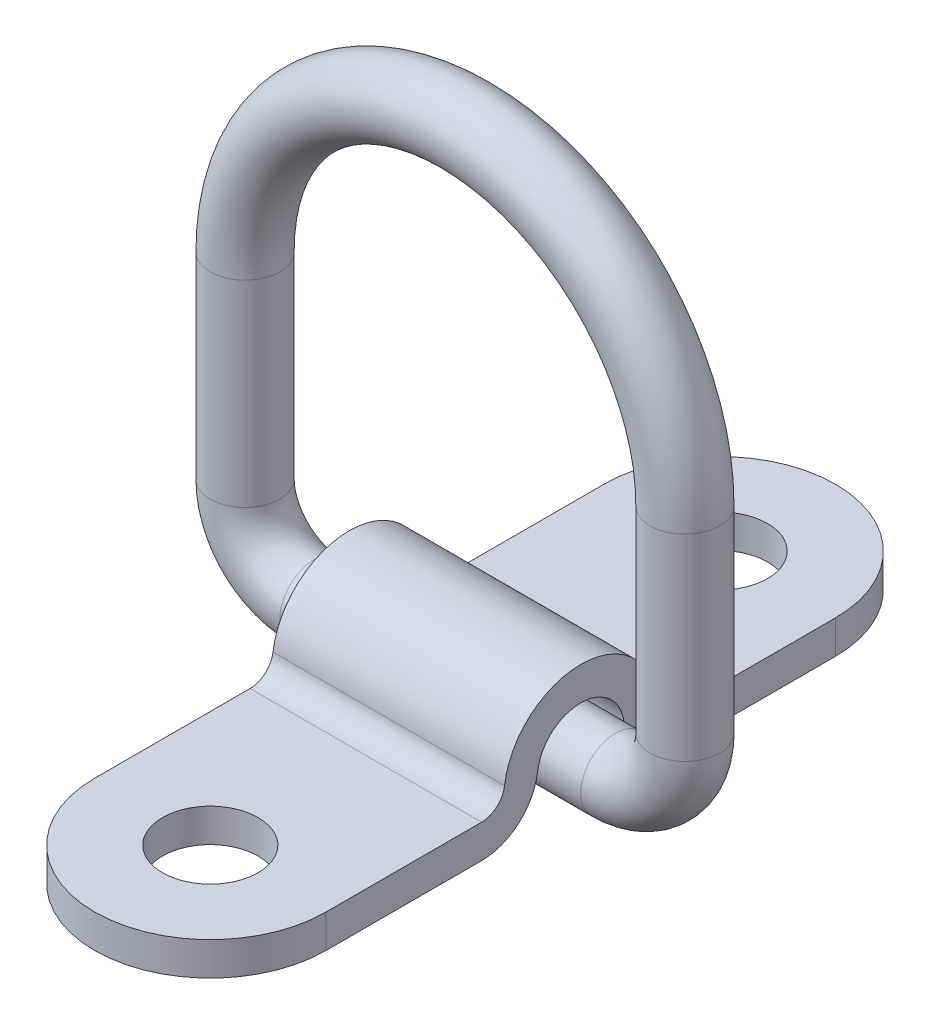
ISO-10303-21;
HEADER;
FILE_DESCRIPTION(('STEP AP214'),'2;1');
FILE_NAME('part.step','',(''),(''),'','','');
FILE_SCHEMA(('AUTOMOTIVE_DESIGN { 1 0 10303 214 1 1 1 1 }'));
ENDSEC;
DATA;
#1=APPLICATION_CONTEXT('core data for automotive mechanical design processes');
#2=APPLICATION_PROTOCOL_DEFINITION('international standard','automotive_design',2000,#1);
#3=PRODUCT_CONTEXT('',#1,'mechanical');
#4=PRODUCT('Part','Part','',(#3));
#5=PRODUCT_RELATED_PRODUCT_CATEGORY('part','',(#4));
#6=PRODUCT_DEFINITION_FORMATION('','',#4);
#7=PRODUCT_DEFINITION_CONTEXT('part definition',#1,'design');
#8=PRODUCT_DEFINITION('design','',#6,#7);
#9=PRODUCT_DEFINITION_SHAPE('','',#8);
#10=(LENGTH_UNIT() NAMED_UNIT(*) SI_UNIT(.MILLI.,.METRE.));
#11=(NAMED_UNIT(*) PLANE_ANGLE_UNIT() SI_UNIT($,.RADIAN.));
#12=(NAMED_UNIT(*) SI_UNIT($,.STERADIAN.) SOLID_ANGLE_UNIT());
#13=UNCERTAINTY_MEASURE_WITH_UNIT(LENGTH_MEASURE(1.E-05),#10,'distance_accuracy_value','');
#14=(GEOMETRIC_REPRESENTATION_CONTEXT(3) GLOBAL_UNCERTAINTY_ASSIGNED_CONTEXT((#13)) GLOBAL_UNIT_ASSIGNED_CONTEXT((#10,
#11,#12)) REPRESENTATION_CONTEXT('',''));
#15=CARTESIAN_POINT('',(0.,0.,0.));
#16=DIRECTION('',(0.,0.,1.));
#17=DIRECTION('',(1.,0.,0.));
#18=AXIS2_PLACEMENT_3D('',#15,#16,#17);
#19=CARTESIAN_POINT('',(7.9375,0.888999999999999,6.8001355133556));
#20=DIRECTION('',(-1.,0.,0.));
#21=DIRECTION('',(0.,0.,1.));
#22=AXIS2_PLACEMENT_3D('',#19,#20,#21);
#23=PLANE('',#22);
#24=DIRECTION('',(0.,0.,-1.));
#25=VECTOR('',#24,1.);
#26=CARTESIAN_POINT('',(7.9375,-2.9845,-25.4));
#27=LINE('',#26,#25);
#28=CARTESIAN_POINT('',(7.9375,-2.9845,-6.8001355133556));
#29=VERTEX_POINT('',#28);
#30=CARTESIAN_POINT('',(7.9375,-2.9845,-17.4625));
#31=VERTEX_POINT('',#30);
#32=EDGE_CURVE('E226',#29,#31,#27,.T.);
#33=ORIENTED_EDGE('',*,*,#32,.T.);
#34=DIRECTION('',(0.,-1.,0.));
#35=VECTOR('',#34,1.);
#36=CARTESIAN_POINT('',(7.9375,35.71875,-17.4625));
#37=LINE('',#36,#35);
#38=CARTESIAN_POINT('',(7.9375,-0.698499999999998,-17.4625));
#39=VERTEX_POINT('',#38);
#40=EDGE_CURVE('E205',#39,#31,#37,.T.);
#41=ORIENTED_EDGE('',*,*,#40,.F.);
#42=DIRECTION('',(0.,0.,1.));
#43=VECTOR('',#42,1.);
#44=CARTESIAN_POINT('',(7.9375,-0.698500000000001,-25.4));
#45=LINE('',#44,#43);
#46=CARTESIAN_POINT('',(7.9375,-0.698500000000001,-6.8001355133556));
#47=VERTEX_POINT('',#46);
#48=EDGE_CURVE('E134',#39,#47,#45,.T.);
#49=ORIENTED_EDGE('',*,*,#48,.T.);
#50=CARTESIAN_POINT('',(7.9375,0.888999999999999,-6.8001355133556));
#51=DIRECTION('',(-1.,0.,0.));
#52=DIRECTION('',(0.,0.,-1.));
#53=AXIS2_PLACEMENT_3D('',#50,#51,#52);
#54=CIRCLE('',#53,1.5875);
#55=CARTESIAN_POINT('',(7.9375,0.683212962962963,-5.22603007044921));
#56=VERTEX_POINT('',#55);
#57=EDGE_CURVE('E126',#47,#56,#54,.T.);
#58=ORIENTED_EDGE('',*,*,#57,.T.);
#59=CARTESIAN_POINT('',(7.9375,0.,0.));
#60=DIRECTION('',(1.,0.,0.));
#61=DIRECTION('',(0.,0.,1.));
#62=AXIS2_PLACEMENT_3D('',#59,#60,#61);
#63=CIRCLE('',#62,5.2705);
#64=CARTESIAN_POINT('',(7.9375,0.683212962962962,5.22603007044921));
#65=VERTEX_POINT('',#64);
#66=EDGE_CURVE('E130',#56,#65,#63,.T.);
#67=ORIENTED_EDGE('',*,*,#66,.T.);
#68=CARTESIAN_POINT('',(7.9375,0.888999999999999,6.8001355133556));
#69=DIRECTION('',(-1.,0.,0.));
#70=DIRECTION('',(0.,0.,1.));
#71=AXIS2_PLACEMENT_3D('',#68,#69,#70);
#72=CIRCLE('',#71,1.5875);
#73=CARTESIAN_POINT('',(7.9375,-0.698500000000001,6.8001355133556));
#74=VERTEX_POINT('',#73);
#75=EDGE_CURVE('E69',#65,#74,#72,.T.);
#76=ORIENTED_EDGE('',*,*,#75,.T.);
#77=DIRECTION('',(0.,0.,1.));
#78=VECTOR('',#77,1.);
#79=CARTESIAN_POINT('',(7.9375,-0.698500000000001,25.4));
#80=LINE('',#79,#78);
#81=CARTESIAN_POINT('',(7.9375,-0.698500000000005,17.4625));
#82=VERTEX_POINT('',#81);
#83=EDGE_CURVE('E151',#74,#82,#80,.T.);
#84=ORIENTED_EDGE('',*,*,#83,.T.);
#85=DIRECTION('',(0.,-1.,0.));
#86=VECTOR('',#85,1.);
#87=CARTESIAN_POINT('',(7.9375,35.71875,17.4625));
#88=LINE('',#87,#86);
#89=CARTESIAN_POINT('',(7.9375,-2.9845,17.4625));
#90=VERTEX_POINT('',#89);
#91=EDGE_CURVE('E216',#82,#90,#88,.T.);
#92=ORIENTED_EDGE('',*,*,#91,.T.);
#93=DIRECTION('',(0.,0.,-1.));
#94=VECTOR('',#93,1.);
#95=CARTESIAN_POINT('',(7.9375,-2.9845,25.4));
#96=LINE('',#95,#94);
#97=CARTESIAN_POINT('',(7.9375,-2.9845,6.8001355133556));
#98=VERTEX_POINT('',#97);
#99=EDGE_CURVE('E110',#90,#98,#96,.T.);
#100=ORIENTED_EDGE('',*,*,#99,.T.);
#101=CARTESIAN_POINT('',(7.9375,0.888999999999999,6.8001355133556));
#102=DIRECTION('',(1.,0.,0.));
#103=DIRECTION('',(0.,0.,-1.));
#104=AXIS2_PLACEMENT_3D('',#101,#102,#103);
#105=CIRCLE('',#104,3.8735);
#106=CARTESIAN_POINT('',(7.9375,0.386879629629629,2.95931823266401));
#107=VERTEX_POINT('',#106);
#108=EDGE_CURVE('E220',#98,#107,#105,.T.);
#109=ORIENTED_EDGE('',*,*,#108,.T.);
#110=CARTESIAN_POINT('',(7.9375,0.,0.));
#111=DIRECTION('',(-1.,0.,0.));
#112=DIRECTION('',(0.,0.,1.));
#113=AXIS2_PLACEMENT_3D('',#110,#111,#112);
#114=CIRCLE('',#113,2.9845);
#115=CARTESIAN_POINT('',(7.9375,0.386879629629629,-2.95931823266401));
#116=VERTEX_POINT('',#115);
#117=EDGE_CURVE('E222',#107,#116,#114,.T.);
#118=ORIENTED_EDGE('',*,*,#117,.T.);
#119=CARTESIAN_POINT('',(7.9375,0.888999999999999,-6.8001355133556));
#120=DIRECTION('',(1.,0.,0.));
#121=DIRECTION('',(0.,0.,1.));
#122=AXIS2_PLACEMENT_3D('',#119,#120,#121);
#123=CIRCLE('',#122,3.8735);
#124=EDGE_CURVE('E224',#116,#29,#123,.T.);
#125=ORIENTED_EDGE('',*,*,#124,.T.);
#126=EDGE_LOOP('',(#33,#41,#49,#58,#67,#76,#84,#92,#100,#109,#118,#125));
#127=FACE_BOUND('',#126,.T.);
#128=ADVANCED_FACE('F45',(#127),#23,.F.);
#129=CARTESIAN_POINT('',(-7.9375,0.888999999999999,6.8001355133556));
#130=DIRECTION('',(-1.,0.,0.));
#131=DIRECTION('',(0.,0.,1.));
#132=AXIS2_PLACEMENT_3D('',#129,#130,#131);
#133=PLANE('',#132);
#134=DIRECTION('',(0.,-1.,0.));
#135=VECTOR('',#134,1.);
#136=CARTESIAN_POINT('',(-7.9375,35.71875,-17.4625));
#137=LINE('',#136,#135);
#138=CARTESIAN_POINT('',(-7.9375,-0.698499999999998,-17.4625));
#139=VERTEX_POINT('',#138);
#140=CARTESIAN_POINT('',(-7.9375,-2.9845,-17.4625));
#141=VERTEX_POINT('',#140);
#142=EDGE_CURVE('E210',#139,#141,#137,.T.);
#143=ORIENTED_EDGE('',*,*,#142,.T.);
#144=DIRECTION('',(0.,0.,-1.));
#145=VECTOR('',#144,1.);
#146=CARTESIAN_POINT('',(-7.9375,-2.9845,-25.4));
#147=LINE('',#146,#145);
#148=CARTESIAN_POINT('',(-7.9375,-2.9845,-6.8001355133556));
#149=VERTEX_POINT('',#148);
#150=EDGE_CURVE('E165',#149,#141,#147,.T.);
#151=ORIENTED_EDGE('',*,*,#150,.F.);
#152=CARTESIAN_POINT('',(-7.9375,0.888999999999999,-6.8001355133556));
#153=DIRECTION('',(1.,0.,0.));
#154=DIRECTION('',(0.,0.,1.));
#155=AXIS2_PLACEMENT_3D('',#152,#153,#154);
#156=CIRCLE('',#155,3.8735);
#157=CARTESIAN_POINT('',(-7.9375,0.386879629629629,-2.95931823266401));
#158=VERTEX_POINT('',#157);
#159=EDGE_CURVE('E163',#158,#149,#156,.T.);
#160=ORIENTED_EDGE('',*,*,#159,.F.);
#161=CARTESIAN_POINT('',(-7.9375,0.,0.));
#162=DIRECTION('',(-1.,0.,0.));
#163=DIRECTION('',(0.,0.,1.));
#164=AXIS2_PLACEMENT_3D('',#161,#162,#163);
#165=CIRCLE('',#164,2.9845);
#166=CARTESIAN_POINT('',(-7.9375,0.386879629629629,2.95931823266401));
#167=VERTEX_POINT('',#166);
#168=EDGE_CURVE('E161',#167,#158,#165,.T.);
#169=ORIENTED_EDGE('',*,*,#168,.F.);
#170=CARTESIAN_POINT('',(-7.9375,0.888999999999999,6.8001355133556));
#171=DIRECTION('',(1.,0.,0.));
#172=DIRECTION('',(0.,0.,-1.));
#173=AXIS2_PLACEMENT_3D('',#170,#171,#172);
#174=CIRCLE('',#173,3.8735);
#175=CARTESIAN_POINT('',(-7.9375,-2.9845,6.8001355133556));
#176=VERTEX_POINT('',#175);
#177=EDGE_CURVE('E159',#176,#167,#174,.T.);
#178=ORIENTED_EDGE('',*,*,#177,.F.);
#179=DIRECTION('',(0.,0.,-1.));
#180=VECTOR('',#179,1.);
#181=CARTESIAN_POINT('',(-7.9375,-2.9845,25.4));
#182=LINE('',#181,#180);
#183=CARTESIAN_POINT('',(-7.9375,-2.9845,17.4625));
#184=VERTEX_POINT('',#183);
#185=EDGE_CURVE('E157',#184,#176,#182,.T.);
#186=ORIENTED_EDGE('',*,*,#185,.F.);
#187=DIRECTION('',(0.,-1.,0.));
#188=VECTOR('',#187,1.);
#189=CARTESIAN_POINT('',(-7.9375,35.71875,17.4625));
#190=LINE('',#189,#188);
#191=CARTESIAN_POINT('',(-7.9375,-0.698500000000001,17.4625));
#192=VERTEX_POINT('',#191);
#193=EDGE_CURVE('E53',#184,#192,#190,.F.);
#194=ORIENTED_EDGE('',*,*,#193,.T.);
#195=DIRECTION('',(0.,0.,1.));
#196=VECTOR('',#195,1.);
#197=CARTESIAN_POINT('',(-7.9375,-0.698500000000001,25.4));
#198=LINE('',#197,#196);
#199=CARTESIAN_POINT('',(-7.9375,-0.698500000000001,6.8001355133556));
#200=VERTEX_POINT('',#199);
#201=EDGE_CURVE('E174',#200,#192,#198,.T.);
#202=ORIENTED_EDGE('',*,*,#201,.F.);
#203=CARTESIAN_POINT('',(-7.9375,0.888999999999999,6.8001355133556));
#204=DIRECTION('',(-1.,0.,0.));
#205=DIRECTION('',(0.,0.,1.));
#206=AXIS2_PLACEMENT_3D('',#203,#204,#205);
#207=CIRCLE('',#206,1.5875);
#208=CARTESIAN_POINT('',(-7.9375,0.683212962962962,5.22603007044921));
#209=VERTEX_POINT('',#208);
#210=EDGE_CURVE('E102',#209,#200,#207,.T.);
#211=ORIENTED_EDGE('',*,*,#210,.F.);
#212=CARTESIAN_POINT('',(-7.9375,0.,0.));
#213=DIRECTION('',(1.,0.,0.));
#214=DIRECTION('',(0.,0.,1.));
#215=AXIS2_PLACEMENT_3D('',#212,#213,#214);
#216=CIRCLE('',#215,5.2705);
#217=CARTESIAN_POINT('',(-7.9375,0.683212962962963,-5.22603007044921));
#218=VERTEX_POINT('',#217);
#219=EDGE_CURVE('E171',#218,#209,#216,.T.);
#220=ORIENTED_EDGE('',*,*,#219,.F.);
#221=CARTESIAN_POINT('',(-7.9375,0.888999999999999,-6.8001355133556));
#222=DIRECTION('',(-1.,0.,0.));
#223=DIRECTION('',(0.,0.,-1.));
#224=AXIS2_PLACEMENT_3D('',#221,#222,#223);
#225=CIRCLE('',#224,1.5875);
#226=CARTESIAN_POINT('',(-7.9375,-0.698500000000001,-6.8001355133556));
#227=VERTEX_POINT('',#226);
#228=EDGE_CURVE('E143',#227,#218,#225,.T.);
#229=ORIENTED_EDGE('',*,*,#228,.F.);
#230=DIRECTION('',(0.,0.,1.));
#231=VECTOR('',#230,1.);
#232=CARTESIAN_POINT('',(-7.9375,-0.698500000000001,-25.4));
#233=LINE('',#232,#231);
#234=EDGE_CURVE('E168',#139,#227,#233,.T.);
#235=ORIENTED_EDGE('',*,*,#234,.F.);
#236=EDGE_LOOP('',(#143,#151,#160,#169,#178,#186,#194,#202,#211,#220,#229,#235));
#237=FACE_BOUND('',#236,.T.);
#238=ADVANCED_FACE('F247',(#237),#133,.T.);
#239=CARTESIAN_POINT('',(7.9375,-2.9845,25.4));
#240=DIRECTION('',(0.,1.,0.));
#241=DIRECTION('',(0.,0.,1.));
#242=AXIS2_PLACEMENT_3D('',#239,#240,#241);
#243=PLANE('',#242);
#244=CARTESIAN_POINT('',(0.,-2.9845,17.4625));
#245=DIRECTION('',(0.,-1.,0.));
#246=DIRECTION('',(0.,0.,-1.));
#247=AXIS2_PLACEMENT_3D('',#244,#245,#246);
#248=CIRCLE('',#247,3.2766);
#249=CARTESIAN_POINT('',(0.,-2.9845,14.1859));
#250=VERTEX_POINT('',#249);
#251=EDGE_CURVE('E196',#250,#250,#248,.T.);
#252=ORIENTED_EDGE('',*,*,#251,.F.);
#253=EDGE_LOOP('',(#252));
#254=FACE_BOUND('',#253,.T.);
#255=CARTESIAN_POINT('',(0.,-2.9845,17.4625));
#256=DIRECTION('',(0.,1.,0.));
#257=DIRECTION('',(0.,0.,-1.));
#258=AXIS2_PLACEMENT_3D('',#255,#256,#257);
#259=CIRCLE('',#258,7.9375);
#260=EDGE_CURVE('E195',#184,#90,#259,.T.);
#261=ORIENTED_EDGE('',*,*,#260,.F.);
#262=ORIENTED_EDGE('',*,*,#185,.T.);
#263=DIRECTION('',(-1.,0.,0.));
#264=VECTOR('',#263,1.);
#265=CARTESIAN_POINT('',(7.9375,-2.9845,6.8001355133556));
#266=LINE('',#265,#264);
#267=EDGE_CURVE('E189',#98,#176,#266,.T.);
#268=ORIENTED_EDGE('',*,*,#267,.F.);
#269=ORIENTED_EDGE('',*,*,#99,.F.);
#270=EDGE_LOOP('',(#261,#262,#268,#269));
#271=FACE_BOUND('',#270,.T.);
#272=ADVANCED_FACE('F47',(#254,#271),#243,.F.);
#273=CARTESIAN_POINT('',(7.9375,0.888999999999999,6.8001355133556));
#274=DIRECTION('',(-1.,0.,0.));
#275=DIRECTION('',(0.,0.,1.));
#276=AXIS2_PLACEMENT_3D('',#273,#274,#275);
#277=CYLINDRICAL_SURFACE('',#276,3.8735);
#278=ORIENTED_EDGE('',*,*,#177,.T.);
#279=DIRECTION('',(-1.,0.,0.));
#280=VECTOR('',#279,1.);
#281=CARTESIAN_POINT('',(7.9375,0.386879629629629,2.95931823266401));
#282=LINE('',#281,#280);
#283=EDGE_CURVE('E186',#107,#167,#282,.T.);
#284=ORIENTED_EDGE('',*,*,#283,.F.);
#285=ORIENTED_EDGE('',*,*,#108,.F.);
#286=ORIENTED_EDGE('',*,*,#267,.T.);
#287=EDGE_LOOP('',(#278,#284,#285,#286));
#288=FACE_BOUND('',#287,.T.);
#289=ADVANCED_FACE('F270',(#288),#277,.T.);
#290=CARTESIAN_POINT('',(7.9375,0.,0.));
#291=DIRECTION('',(-1.,0.,0.));
#292=DIRECTION('',(0.,0.,1.));
#293=AXIS2_PLACEMENT_3D('',#290,#291,#292);
#294=CYLINDRICAL_SURFACE('',#293,2.9845);
#295=ORIENTED_EDGE('',*,*,#168,.T.);
#296=DIRECTION('',(-1.,0.,0.));
#297=VECTOR('',#296,1.);
#298=CARTESIAN_POINT('',(7.9375,0.386879629629629,-2.95931823266401));
#299=LINE('',#298,#297);
#300=EDGE_CURVE('E183',#116,#158,#299,.T.);
#301=ORIENTED_EDGE('',*,*,#300,.F.);
#302=ORIENTED_EDGE('',*,*,#117,.F.);
#303=ORIENTED_EDGE('',*,*,#283,.T.);
#304=EDGE_LOOP('',(#295,#301,#302,#303));
#305=FACE_BOUND('',#304,.T.);
#306=ADVANCED_FACE('F275',(#305),#294,.F.);
#307=CARTESIAN_POINT('',(7.9375,0.888999999999999,-6.8001355133556));
#308=DIRECTION('',(-1.,0.,0.));
#309=DIRECTION('',(0.,0.,1.));
#310=AXIS2_PLACEMENT_3D('',#307,#308,#309);
#311=CYLINDRICAL_SURFACE('',#310,3.8735);
#312=ORIENTED_EDGE('',*,*,#159,.T.);
#313=DIRECTION('',(-1.,0.,0.));
#314=VECTOR('',#313,1.);
#315=CARTESIAN_POINT('',(7.9375,-2.9845,-6.8001355133556));
#316=LINE('',#315,#314);
#317=EDGE_CURVE('E180',#29,#149,#316,.T.);
#318=ORIENTED_EDGE('',*,*,#317,.F.);
#319=ORIENTED_EDGE('',*,*,#124,.F.);
#320=ORIENTED_EDGE('',*,*,#300,.T.);
#321=EDGE_LOOP('',(#312,#318,#319,#320));
#322=FACE_BOUND('',#321,.T.);
#323=ADVANCED_FACE('F277',(#322),#311,.T.);
#324=CARTESIAN_POINT('',(7.9375,-2.9845,-25.4));
#325=DIRECTION('',(0.,1.,0.));
#326=DIRECTION('',(0.,0.,1.));
#327=AXIS2_PLACEMENT_3D('',#324,#325,#326);
#328=PLANE('',#327);
#329=CARTESIAN_POINT('',(0.,-2.9845,-17.4625));
#330=DIRECTION('',(0.,-1.,0.));
#331=DIRECTION('',(0.,0.,1.));
#332=AXIS2_PLACEMENT_3D('',#329,#330,#331);
#333=CIRCLE('',#332,3.2766);
#334=CARTESIAN_POINT('',(0.,-2.9845,-14.1859));
#335=VERTEX_POINT('',#334);
#336=EDGE_CURVE('E199',#335,#335,#333,.T.);
#337=ORIENTED_EDGE('',*,*,#336,.F.);
#338=EDGE_LOOP('',(#337));
#339=FACE_BOUND('',#338,.T.);
#340=ORIENTED_EDGE('',*,*,#150,.T.);
#341=CARTESIAN_POINT('',(0.,-2.9845,-17.4625));
#342=DIRECTION('',(0.,1.,0.));
#343=DIRECTION('',(0.,0.,1.));
#344=AXIS2_PLACEMENT_3D('',#341,#342,#343);
#345=CIRCLE('',#344,7.9375);
#346=EDGE_CURVE('E240',#31,#141,#345,.T.);
#347=ORIENTED_EDGE('',*,*,#346,.F.);
#348=ORIENTED_EDGE('',*,*,#32,.F.);
#349=ORIENTED_EDGE('',*,*,#317,.T.);
#350=EDGE_LOOP('',(#340,#347,#348,#349));
#351=FACE_BOUND('',#350,.T.);
#352=ADVANCED_FACE('F237',(#339,#351),#328,.F.);
#353=CARTESIAN_POINT('',(7.9375,-0.698500000000001,-25.4));
#354=DIRECTION('',(0.,-1.,0.));
#355=DIRECTION('',(0.,0.,-1.));
#356=AXIS2_PLACEMENT_3D('',#353,#354,#355);
#357=PLANE('',#356);
#358=CARTESIAN_POINT('',(0.,-0.698499999999998,-17.4625));
#359=DIRECTION('',(0.,-1.,0.));
#360=DIRECTION('',(0.,0.,-1.));
#361=AXIS2_PLACEMENT_3D('',#358,#359,#360);
#362=CIRCLE('',#361,3.2766);
#363=CARTESIAN_POINT('',(0.,-0.698499999999998,-20.7391));
#364=VERTEX_POINT('',#363);
#365=EDGE_CURVE('E197',#364,#364,#362,.T.);
#366=ORIENTED_EDGE('',*,*,#365,.T.);
#367=EDGE_LOOP('',(#366));
#368=FACE_BOUND('',#367,.T.);
#369=CARTESIAN_POINT('',(0.,-0.698499999999998,-17.4625));
#370=DIRECTION('',(0.,-1.,0.));
#371=DIRECTION('',(0.,0.,-1.));
#372=AXIS2_PLACEMENT_3D('',#369,#370,#371);
#373=CIRCLE('',#372,7.9375);
#374=EDGE_CURVE('E12',#39,#139,#373,.F.);
#375=ORIENTED_EDGE('',*,*,#374,.T.);
#376=ORIENTED_EDGE('',*,*,#234,.T.);
#377=DIRECTION('',(-1.,0.,0.));
#378=VECTOR('',#377,1.);
#379=CARTESIAN_POINT('',(7.9375,-0.698500000000001,-6.8001355133556));
#380=LINE('',#379,#378);
#381=EDGE_CURVE('E146',#47,#227,#380,.T.);
#382=ORIENTED_EDGE('',*,*,#381,.F.);
#383=ORIENTED_EDGE('',*,*,#48,.F.);
#384=EDGE_LOOP('',(#375,#376,#382,#383));
#385=FACE_BOUND('',#384,.T.);
#386=ADVANCED_FACE('F285',(#368,#385),#357,.F.);
#387=CARTESIAN_POINT('',(7.9375,0.888999999999999,-6.8001355133556));
#388=DIRECTION('',(-1.,0.,0.));
#389=DIRECTION('',(0.,0.,1.));
#390=AXIS2_PLACEMENT_3D('',#387,#388,#389);
#391=CYLINDRICAL_SURFACE('',#390,1.5875);
#392=ORIENTED_EDGE('',*,*,#228,.T.);
#393=DIRECTION('',(-1.,0.,0.));
#394=VECTOR('',#393,1.);
#395=CARTESIAN_POINT('',(7.9375,0.683212962962963,-5.22603007044921));
#396=LINE('',#395,#394);
#397=EDGE_CURVE('E140',#56,#218,#396,.T.);
#398=ORIENTED_EDGE('',*,*,#397,.F.);
#399=ORIENTED_EDGE('',*,*,#57,.F.);
#400=ORIENTED_EDGE('',*,*,#381,.T.);
#401=EDGE_LOOP('',(#392,#398,#399,#400));
#402=FACE_BOUND('',#401,.T.);
#403=ADVANCED_FACE('F141',(#402),#391,.F.);
#404=CARTESIAN_POINT('',(7.9375,0.,0.));
#405=DIRECTION('',(-1.,0.,0.));
#406=DIRECTION('',(0.,0.,1.));
#407=AXIS2_PLACEMENT_3D('',#404,#405,#406);
#408=CYLINDRICAL_SURFACE('',#407,5.2705);
#409=ORIENTED_EDGE('',*,*,#219,.T.);
#410=DIRECTION('',(-1.,0.,0.));
#411=VECTOR('',#410,1.);
#412=CARTESIAN_POINT('',(7.9375,0.683212962962962,5.22603007044921));
#413=LINE('',#412,#411);
#414=EDGE_CURVE('E147',#65,#209,#413,.T.);
#415=ORIENTED_EDGE('',*,*,#414,.F.);
#416=ORIENTED_EDGE('',*,*,#66,.F.);
#417=ORIENTED_EDGE('',*,*,#397,.T.);
#418=EDGE_LOOP('',(#409,#415,#416,#417));
#419=FACE_BOUND('',#418,.T.);
#420=ADVANCED_FACE('F149',(#419),#408,.T.);
#421=CARTESIAN_POINT('',(7.9375,0.888999999999999,6.8001355133556));
#422=DIRECTION('',(-1.,0.,0.));
#423=DIRECTION('',(0.,0.,1.));
#424=AXIS2_PLACEMENT_3D('',#421,#422,#423);
#425=CYLINDRICAL_SURFACE('',#424,1.5875);
#426=ORIENTED_EDGE('',*,*,#210,.T.);
#427=DIRECTION('',(-1.,0.,0.));
#428=VECTOR('',#427,1.);
#429=CARTESIAN_POINT('',(7.9375,-0.698500000000001,6.8001355133556));
#430=LINE('',#429,#428);
#431=EDGE_CURVE('E156',#74,#200,#430,.T.);
#432=ORIENTED_EDGE('',*,*,#431,.F.);
#433=ORIENTED_EDGE('',*,*,#75,.F.);
#434=ORIENTED_EDGE('',*,*,#414,.T.);
#435=EDGE_LOOP('',(#426,#432,#433,#434));
#436=FACE_BOUND('',#435,.T.);
#437=ADVANCED_FACE('F301',(#436),#425,.F.);
#438=CARTESIAN_POINT('',(7.9375,-0.698500000000001,25.4));
#439=DIRECTION('',(0.,-1.,0.));
#440=DIRECTION('',(0.,0.,-1.));
#441=AXIS2_PLACEMENT_3D('',#438,#439,#440);
#442=PLANE('',#441);
#443=CARTESIAN_POINT('',(0.,-0.698499999999998,17.4625));
#444=DIRECTION('',(0.,-1.,0.));
#445=DIRECTION('',(0.,0.,-1.));
#446=AXIS2_PLACEMENT_3D('',#443,#444,#445);
#447=CIRCLE('',#446,3.2766);
#448=CARTESIAN_POINT('',(0.,-0.698499999999998,14.1859));
#449=VERTEX_POINT('',#448);
#450=EDGE_CURVE('E193',#449,#449,#447,.T.);
#451=ORIENTED_EDGE('',*,*,#450,.T.);
#452=EDGE_LOOP('',(#451));
#453=FACE_BOUND('',#452,.T.);
#454=ORIENTED_EDGE('',*,*,#201,.T.);
#455=CARTESIAN_POINT('',(0.,-0.698499999999998,17.4625));
#456=DIRECTION('',(0.,-1.,0.));
#457=DIRECTION('',(0.,0.,-1.));
#458=AXIS2_PLACEMENT_3D('',#455,#456,#457);
#459=CIRCLE('',#458,7.9375);
#460=EDGE_CURVE('E60',#192,#82,#459,.F.);
#461=ORIENTED_EDGE('',*,*,#460,.T.);
#462=ORIENTED_EDGE('',*,*,#83,.F.);
#463=ORIENTED_EDGE('',*,*,#431,.T.);
#464=EDGE_LOOP('',(#454,#461,#462,#463));
#465=FACE_BOUND('',#464,.T.);
#466=ADVANCED_FACE('F263',(#453,#465),#442,.F.);
#467=CARTESIAN_POINT('',(0.,35.71875,17.4625));
#468=DIRECTION('',(0.,-1.,0.));
#469=DIRECTION('',(0.,0.,-1.));
#470=AXIS2_PLACEMENT_3D('',#467,#468,#469);
#471=CYLINDRICAL_SURFACE('',#470,7.9375);
#472=ORIENTED_EDGE('',*,*,#260,.T.);
#473=ORIENTED_EDGE('',*,*,#91,.F.);
#474=ORIENTED_EDGE('',*,*,#460,.F.);
#475=ORIENTED_EDGE('',*,*,#193,.F.);
#476=EDGE_LOOP('',(#472,#473,#474,#475));
#477=FACE_BOUND('',#476,.T.);
#478=ADVANCED_FACE('F260',(#477),#471,.T.);
#479=CARTESIAN_POINT('',(0.,35.71875,17.4625));
#480=DIRECTION('',(0.,-1.,0.));
#481=DIRECTION('',(0.,0.,-1.));
#482=AXIS2_PLACEMENT_3D('',#479,#480,#481);
#483=CYLINDRICAL_SURFACE('',#482,3.2766);
#484=ORIENTED_EDGE('',*,*,#251,.T.);
#485=EDGE_LOOP('',(#484));
#486=FACE_BOUND('',#485,.T.);
#487=ORIENTED_EDGE('',*,*,#450,.F.);
#488=EDGE_LOOP('',(#487));
#489=FACE_BOUND('',#488,.T.);
#490=ADVANCED_FACE('F326',(#486,#489),#483,.F.);
#491=CARTESIAN_POINT('',(0.,35.71875,-17.4625));
#492=DIRECTION('',(0.,-1.,0.));
#493=DIRECTION('',(0.,0.,-1.));
#494=AXIS2_PLACEMENT_3D('',#491,#492,#493);
#495=CYLINDRICAL_SURFACE('',#494,3.2766);
#496=ORIENTED_EDGE('',*,*,#336,.T.);
#497=EDGE_LOOP('',(#496));
#498=FACE_BOUND('',#497,.T.);
#499=ORIENTED_EDGE('',*,*,#365,.F.);
#500=EDGE_LOOP('',(#499));
#501=FACE_BOUND('',#500,.T.);
#502=ADVANCED_FACE('F332',(#498,#501),#495,.F.);
#503=CARTESIAN_POINT('',(0.,35.71875,-17.4625));
#504=DIRECTION('',(0.,-1.,0.));
#505=DIRECTION('',(0.,0.,-1.));
#506=AXIS2_PLACEMENT_3D('',#503,#504,#505);
#507=CYLINDRICAL_SURFACE('',#506,7.9375);
#508=ORIENTED_EDGE('',*,*,#346,.T.);
#509=ORIENTED_EDGE('',*,*,#142,.F.);
#510=ORIENTED_EDGE('',*,*,#374,.F.);
#511=ORIENTED_EDGE('',*,*,#40,.T.);
#512=EDGE_LOOP('',(#508,#509,#510,#511));
#513=FACE_BOUND('',#512,.T.);
#514=ADVANCED_FACE('F251',(#513),#507,.T.);
#515=CLOSED_SHELL('',(#128,#238,#272,#289,#306,#323,#352,#386,#403,#420,#437,#466,#478,#490,
#502,#514));
#516=MANIFOLD_SOLID_BREP('B2',#515);
#517=CARTESIAN_POINT('',(10.31875,4.7625,0.));
#518=DIRECTION('',(0.,0.,-1.));
#519=DIRECTION('',(-1.,0.,0.));
#520=AXIS2_PLACEMENT_3D('',#517,#518,#519);
#521=TOROIDAL_SURFACE('',#520,4.7625,2.38125000000001);
#522=CARTESIAN_POINT('',(15.08125,4.7625,0.));
#523=DIRECTION('',(0.,1.,0.));
#524=DIRECTION('',(0.,0.,-1.));
#525=AXIS2_PLACEMENT_3D('',#522,#523,#524);
#526=CIRCLE('',#525,2.38125000000001);
#527=CARTESIAN_POINT('',(17.4625,4.7625,0.));
#528=VERTEX_POINT('',#527);
#529=EDGE_CURVE('E393',#528,#528,#526,.T.);
#530=CARTESIAN_POINT('',(10.31875,0.,0.));
#531=DIRECTION('',(1.,0.,0.));
#532=DIRECTION('',(0.,0.,-1.));
#533=AXIS2_PLACEMENT_3D('',#530,#531,#532);
#534=CIRCLE('',#533,2.38125000000001);
#535=CARTESIAN_POINT('',(10.31875,-2.38125,0.));
#536=VERTEX_POINT('',#535);
#537=EDGE_CURVE('E44',#536,#536,#534,.T.);
#538=CARTESIAN_POINT('',(10.31875,4.7625,0.));
#539=DIRECTION('',(0.,0.,-1.));
#540=DIRECTION('',(-1.,0.,0.));
#541=AXIS2_PLACEMENT_3D('',#538,#539,#540);
#542=CIRCLE('',#541,7.14375);
#543=EDGE_CURVE('',#528,#536,#542,.T.);
#544=ORIENTED_EDGE('',*,*,#529,.F.);
#545=ORIENTED_EDGE('',*,*,#537,.T.);
#546=ORIENTED_EDGE('',*,*,#543,.T.);
#547=ORIENTED_EDGE('',*,*,#543,.F.);
#548=EDGE_LOOP('',(#544,#546,#545,#547));
#549=FACE_BOUND('',#548,.T.);
#550=ADVANCED_FACE('F387',(#549),#521,.T.);
#551=CARTESIAN_POINT('',(15.08125,18.25625,0.));
#552=DIRECTION('',(0.,-1.,0.));
#553=DIRECTION('',(1.,0.,0.));
#554=AXIS2_PLACEMENT_3D('',#551,#552,#553);
#555=CYLINDRICAL_SURFACE('',#554,2.38125000000001);
#556=CARTESIAN_POINT('',(15.08125,18.25625,0.));
#557=DIRECTION('',(0.,1.,0.));
#558=DIRECTION('',(0.,0.,-1.));
#559=AXIS2_PLACEMENT_3D('',#556,#557,#558);
#560=CIRCLE('',#559,2.38125000000001);
#561=CARTESIAN_POINT('',(17.4625,18.25625,0.));
#562=VERTEX_POINT('',#561);
#563=EDGE_CURVE('E397',#562,#562,#560,.T.);
#564=ORIENTED_EDGE('',*,*,#563,.F.);
#565=EDGE_LOOP('',(#564));
#566=FACE_BOUND('',#565,.T.);
#567=ORIENTED_EDGE('',*,*,#529,.T.);
#568=EDGE_LOOP('',(#567));
#569=FACE_BOUND('',#568,.T.);
#570=ADVANCED_FACE('F431',(#566,#569),#555,.T.);
#571=CARTESIAN_POINT('',(0.,18.25625,0.));
#572=DIRECTION('',(0.,0.,-1.));
#573=DIRECTION('',(-1.,0.,0.));
#574=AXIS2_PLACEMENT_3D('',#571,#572,#573);
#575=TOROIDAL_SURFACE('',#574,15.08125,2.38125000000001);
#576=CARTESIAN_POINT('',(-15.08125,18.25625,0.));
#577=DIRECTION('',(0.,-1.,0.));
#578=DIRECTION('',(0.,0.,-1.));
#579=AXIS2_PLACEMENT_3D('',#576,#577,#578);
#580=CIRCLE('',#579,2.38125000000001);
#581=CARTESIAN_POINT('',(-17.4625,18.25625,0.));
#582=VERTEX_POINT('',#581);
#583=EDGE_CURVE('E401',#582,#582,#580,.T.);
#584=CARTESIAN_POINT('',(0.,18.25625,0.));
#585=DIRECTION('',(0.,0.,-1.));
#586=DIRECTION('',(-1.,0.,0.));
#587=AXIS2_PLACEMENT_3D('',#584,#585,#586);
#588=CIRCLE('',#587,17.4625);
#589=EDGE_CURVE('',#582,#562,#588,.T.);
#590=ORIENTED_EDGE('',*,*,#583,.F.);
#591=ORIENTED_EDGE('',*,*,#563,.T.);
#592=ORIENTED_EDGE('',*,*,#589,.T.);
#593=ORIENTED_EDGE('',*,*,#589,.F.);
#594=EDGE_LOOP('',(#590,#592,#591,#593));
#595=FACE_BOUND('',#594,.T.);
#596=ADVANCED_FACE('F425',(#595),#575,.T.);
#597=CARTESIAN_POINT('',(-15.08125,4.7625,0.));
#598=DIRECTION('',(0.,1.,0.));
#599=DIRECTION('',(-1.,0.,0.));
#600=AXIS2_PLACEMENT_3D('',#597,#598,#599);
#601=CYLINDRICAL_SURFACE('',#600,2.38125000000001);
#602=CARTESIAN_POINT('',(-15.08125,4.7625,0.));
#603=DIRECTION('',(0.,-1.,0.));
#604=DIRECTION('',(0.,0.,-1.));
#605=AXIS2_PLACEMENT_3D('',#602,#603,#604);
#606=CIRCLE('',#605,2.38125000000001);
#607=CARTESIAN_POINT('',(-17.4625,4.7625,0.));
#608=VERTEX_POINT('',#607);
#609=EDGE_CURVE('E406',#608,#608,#606,.T.);
#610=ORIENTED_EDGE('',*,*,#609,.F.);
#611=EDGE_LOOP('',(#610));
#612=FACE_BOUND('',#611,.T.);
#613=ORIENTED_EDGE('',*,*,#583,.T.);
#614=EDGE_LOOP('',(#613));
#615=FACE_BOUND('',#614,.T.);
#616=ADVANCED_FACE('F419',(#612,#615),#601,.T.);
#617=CARTESIAN_POINT('',(-10.31875,4.7625,0.));
#618=DIRECTION('',(0.,0.,-1.));
#619=DIRECTION('',(-1.,0.,0.));
#620=AXIS2_PLACEMENT_3D('',#617,#618,#619);
#621=TOROIDAL_SURFACE('',#620,4.7625,2.38125000000001);
#622=CARTESIAN_POINT('',(-10.31875,0.,0.));
#623=DIRECTION('',(1.,0.,0.));
#624=DIRECTION('',(0.,0.,-1.));
#625=AXIS2_PLACEMENT_3D('',#622,#623,#624);
#626=CIRCLE('',#625,2.38125000000001);
#627=CARTESIAN_POINT('',(-10.31875,-2.38125,0.));
#628=VERTEX_POINT('',#627);
#629=EDGE_CURVE('E409',#628,#628,#626,.T.);
#630=CARTESIAN_POINT('',(-10.31875,4.7625,0.));
#631=DIRECTION('',(0.,0.,-1.));
#632=DIRECTION('',(-1.,0.,0.));
#633=AXIS2_PLACEMENT_3D('',#630,#631,#632);
#634=CIRCLE('',#633,7.14375000000001);
#635=EDGE_CURVE('',#628,#608,#634,.T.);
#636=ORIENTED_EDGE('',*,*,#629,.F.);
#637=ORIENTED_EDGE('',*,*,#609,.T.);
#638=ORIENTED_EDGE('',*,*,#635,.T.);
#639=ORIENTED_EDGE('',*,*,#635,.F.);
#640=EDGE_LOOP('',(#636,#638,#637,#639));
#641=FACE_BOUND('',#640,.T.);
#642=ADVANCED_FACE('F416',(#641),#621,.T.);
#643=CARTESIAN_POINT('',(-10.31875,0.,0.));
#644=DIRECTION('',(1.,0.,0.));
#645=DIRECTION('',(0.,0.,-1.));
#646=AXIS2_PLACEMENT_3D('',#643,#644,#645);
#647=CYLINDRICAL_SURFACE('',#646,2.38125000000001);
#648=ORIENTED_EDGE('',*,*,#629,.T.);
#649=EDGE_LOOP('',(#648));
#650=FACE_BOUND('',#649,.T.);
#651=ORIENTED_EDGE('',*,*,#537,.F.);
#652=EDGE_LOOP('',(#651));
#653=FACE_BOUND('',#652,.T.);
#654=ADVANCED_FACE('F413',(#650,#653),#647,.T.);
#655=CLOSED_SHELL('',(#550,#570,#596,#616,#642,#654));
#656=MANIFOLD_SOLID_BREP('B6',#655);
#657=ADVANCED_BREP_SHAPE_REPRESENTATION('',(#18,#516,#656),#14);
#658=SHAPE_DEFINITION_REPRESENTATION(#9,#657);
ENDSEC;
END-ISO-10303-21;
